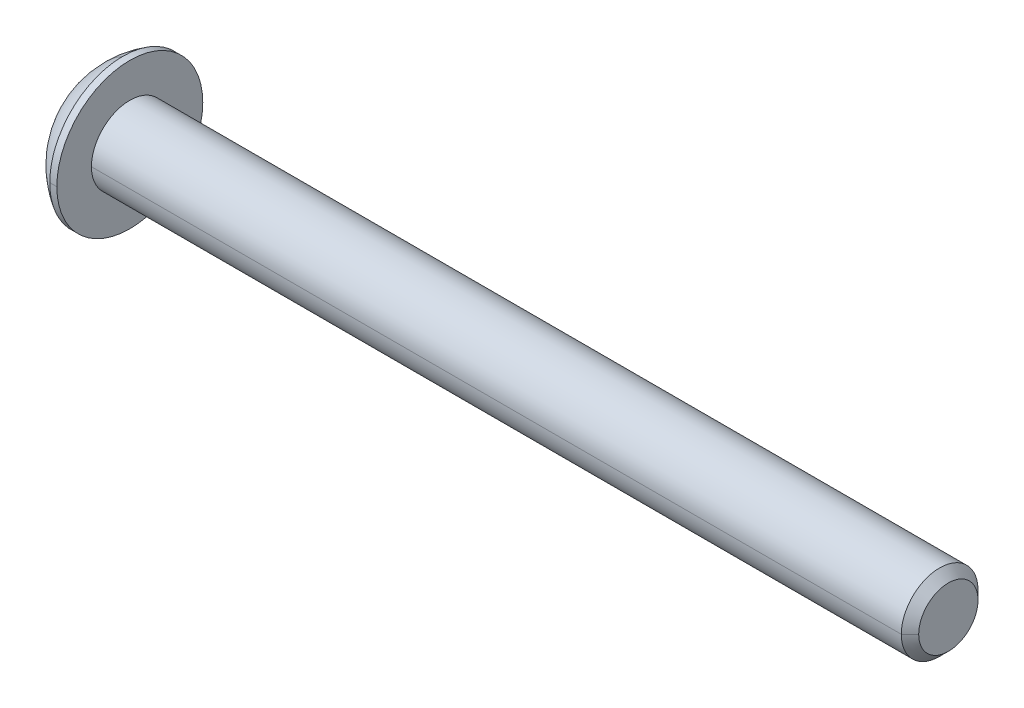
ISO-10303-21;
HEADER;
FILE_DESCRIPTION(('STEP AP214'),'2;1');
FILE_NAME('part.step','',(''),(''),'','','');
FILE_SCHEMA(('AUTOMOTIVE_DESIGN { 1 0 10303 214 1 1 1 1 }'));
ENDSEC;
DATA;
#1=APPLICATION_CONTEXT('core data for automotive mechanical design processes');
#2=APPLICATION_PROTOCOL_DEFINITION('international standard','automotive_design',2000,#1);
#3=PRODUCT_CONTEXT('',#1,'mechanical');
#4=PRODUCT('Part','Part','',(#3));
#5=PRODUCT_RELATED_PRODUCT_CATEGORY('part','',(#4));
#6=PRODUCT_DEFINITION_FORMATION('','',#4);
#7=PRODUCT_DEFINITION_CONTEXT('part definition',#1,'design');
#8=PRODUCT_DEFINITION('design','',#6,#7);
#9=PRODUCT_DEFINITION_SHAPE('','',#8);
#10=(LENGTH_UNIT() NAMED_UNIT(*) SI_UNIT(.MILLI.,.METRE.));
#11=(NAMED_UNIT(*) PLANE_ANGLE_UNIT() SI_UNIT($,.RADIAN.));
#12=(NAMED_UNIT(*) SI_UNIT($,.STERADIAN.) SOLID_ANGLE_UNIT());
#13=UNCERTAINTY_MEASURE_WITH_UNIT(LENGTH_MEASURE(1.E-05),#10,'distance_accuracy_value','');
#14=(GEOMETRIC_REPRESENTATION_CONTEXT(3) GLOBAL_UNCERTAINTY_ASSIGNED_CONTEXT((#13)) GLOBAL_UNIT_ASSIGNED_CONTEXT((#10,
#11,#12)) REPRESENTATION_CONTEXT('',''));
#15=CARTESIAN_POINT('',(0.,0.,0.));
#16=DIRECTION('',(0.,0.,1.));
#17=DIRECTION('',(1.,0.,0.));
#18=AXIS2_PLACEMENT_3D('',#15,#16,#17);
#19=CARTESIAN_POINT('',(-997.989959248641,0.,0.));
#20=DIRECTION('',(-1.,0.,0.));
#21=DIRECTION('',(0.,0.,1.));
#22=AXIS2_PLACEMENT_3D('',#19,#20,#21);
#23=CONICAL_SURFACE('',#22,1732.05080756886,1.0471975511966);
#24=DIRECTION('',(-0.5,0.,0.866025403784436));
#25=VECTOR('',#24,1.);
#26=CARTESIAN_POINT('',(2.01004075135859,0.,0.));
#27=LINE('',#26,#25);
#28=CARTESIAN_POINT('',(2.01004075135859,0.,0.));
#29=VERTEX_POINT('',#28);
#30=CARTESIAN_POINT('',(1.3208,0.,1.1938));
#31=VERTEX_POINT('',#30);
#32=EDGE_CURVE('E10',#29,#31,#27,.T.);
#33=ORIENTED_EDGE('',*,*,#32,.F.);
#34=DIRECTION('',(-0.5,0.,-0.866025403784436));
#35=VECTOR('',#34,1.);
#36=CARTESIAN_POINT('',(2.01004075135859,0.,0.));
#37=LINE('',#36,#35);
#38=CARTESIAN_POINT('',(1.3208,0.,-1.1938));
#39=VERTEX_POINT('',#38);
#40=EDGE_CURVE('E26',#29,#39,#37,.T.);
#41=ORIENTED_EDGE('',*,*,#40,.T.);
#42=CARTESIAN_POINT('',(1.3208,0.,0.));
#43=DIRECTION('',(-1.,0.,0.));
#44=DIRECTION('',(0.,0.,1.));
#45=AXIS2_PLACEMENT_3D('',#42,#43,#44);
#46=CIRCLE('',#45,1.1938);
#47=CARTESIAN_POINT('',(1.3208,-1.03386112703786,-0.5969));
#48=VERTEX_POINT('',#47);
#49=EDGE_CURVE('E185',#39,#48,#46,.T.);
#50=ORIENTED_EDGE('',*,*,#49,.T.);
#51=CARTESIAN_POINT('',(1.3208,0.,0.));
#52=DIRECTION('',(-1.,0.,0.));
#53=DIRECTION('',(0.,0.,1.));
#54=AXIS2_PLACEMENT_3D('',#51,#52,#53);
#55=CIRCLE('',#54,1.1938);
#56=CARTESIAN_POINT('',(1.3208,-1.03386112703786,0.5969));
#57=VERTEX_POINT('',#56);
#58=EDGE_CURVE('E182',#48,#57,#55,.T.);
#59=ORIENTED_EDGE('',*,*,#58,.T.);
#60=CARTESIAN_POINT('',(1.3208,0.,0.));
#61=DIRECTION('',(-1.,0.,0.));
#62=DIRECTION('',(0.,0.,1.));
#63=AXIS2_PLACEMENT_3D('',#60,#61,#62);
#64=CIRCLE('',#63,1.1938);
#65=EDGE_CURVE('E19',#57,#31,#64,.T.);
#66=ORIENTED_EDGE('',*,*,#65,.T.);
#67=EDGE_LOOP('',(#33,#41,#50,#59,#66));
#68=FACE_BOUND('',#67,.T.);
#69=ADVANCED_FACE('F15',(#68),#23,.F.);
#70=CARTESIAN_POINT('',(-997.989959248641,0.,0.));
#71=DIRECTION('',(-1.,0.,0.));
#72=DIRECTION('',(0.,0.,1.));
#73=AXIS2_PLACEMENT_3D('',#70,#71,#72);
#74=CONICAL_SURFACE('',#73,1732.05080756886,1.0471975511966);
#75=ORIENTED_EDGE('',*,*,#40,.F.);
#76=ORIENTED_EDGE('',*,*,#32,.T.);
#77=CARTESIAN_POINT('',(1.3208,0.,0.));
#78=DIRECTION('',(-1.,0.,0.));
#79=DIRECTION('',(0.,0.,1.));
#80=AXIS2_PLACEMENT_3D('',#77,#78,#79);
#81=CIRCLE('',#80,1.1938);
#82=CARTESIAN_POINT('',(1.3208,1.03386112703786,0.5969));
#83=VERTEX_POINT('',#82);
#84=EDGE_CURVE('E229',#31,#83,#81,.T.);
#85=ORIENTED_EDGE('',*,*,#84,.T.);
#86=CARTESIAN_POINT('',(1.3208,0.,0.));
#87=DIRECTION('',(-1.,0.,0.));
#88=DIRECTION('',(0.,0.,1.));
#89=AXIS2_PLACEMENT_3D('',#86,#87,#88);
#90=CIRCLE('',#89,1.1938);
#91=CARTESIAN_POINT('',(1.3208,1.03386112703786,-0.5969));
#92=VERTEX_POINT('',#91);
#93=EDGE_CURVE('E232',#83,#92,#90,.T.);
#94=ORIENTED_EDGE('',*,*,#93,.T.);
#95=CARTESIAN_POINT('',(1.3208,0.,0.));
#96=DIRECTION('',(-1.,0.,0.));
#97=DIRECTION('',(0.,0.,1.));
#98=AXIS2_PLACEMENT_3D('',#95,#96,#97);
#99=CIRCLE('',#98,1.1938);
#100=EDGE_CURVE('E134',#92,#39,#99,.T.);
#101=ORIENTED_EDGE('',*,*,#100,.T.);
#102=EDGE_LOOP('',(#75,#76,#85,#94,#101));
#103=FACE_BOUND('',#102,.T.);
#104=ADVANCED_FACE('F427',(#103),#74,.F.);
#105=CARTESIAN_POINT('',(1.3208,-2.06772225407573,-1.1938));
#106=DIRECTION('',(1.,0.,0.));
#107=DIRECTION('',(0.,1.,0.));
#108=AXIS2_PLACEMENT_3D('',#105,#106,#107);
#109=PLANE('',#108);
#110=ORIENTED_EDGE('',*,*,#100,.F.);
#111=DIRECTION('',(0.,0.5,0.866025403784439));
#112=VECTOR('',#111,1.);
#113=CARTESIAN_POINT('',(1.3208,1.37848150271715,0.));
#114=LINE('',#113,#112);
#115=CARTESIAN_POINT('',(1.3208,0.689240751358577,-1.1938));
#116=VERTEX_POINT('',#115);
#117=EDGE_CURVE('E157',#116,#92,#114,.T.);
#118=ORIENTED_EDGE('',*,*,#117,.F.);
#119=DIRECTION('',(0.,1.,0.));
#120=VECTOR('',#119,1.);
#121=CARTESIAN_POINT('',(1.3208,0.689240751358577,-1.1938));
#122=LINE('',#121,#120);
#123=EDGE_CURVE('E205',#39,#116,#122,.T.);
#124=ORIENTED_EDGE('',*,*,#123,.F.);
#125=EDGE_LOOP('',(#110,#118,#124));
#126=FACE_BOUND('',#125,.T.);
#127=ADVANCED_FACE('F422',(#126),#109,.F.);
#128=CARTESIAN_POINT('',(1.3208,-2.06772225407573,-1.1938));
#129=DIRECTION('',(1.,0.,0.));
#130=DIRECTION('',(0.,1.,0.));
#131=AXIS2_PLACEMENT_3D('',#128,#129,#130);
#132=PLANE('',#131);
#133=ORIENTED_EDGE('',*,*,#49,.F.);
#134=DIRECTION('',(0.,1.,0.));
#135=VECTOR('',#134,1.);
#136=CARTESIAN_POINT('',(1.3208,0.689240751358577,-1.1938));
#137=LINE('',#136,#135);
#138=CARTESIAN_POINT('',(1.3208,-0.689240751358574,-1.1938));
#139=VERTEX_POINT('',#138);
#140=EDGE_CURVE('E200',#139,#39,#137,.T.);
#141=ORIENTED_EDGE('',*,*,#140,.F.);
#142=DIRECTION('',(0.,0.5,-0.866025403784439));
#143=VECTOR('',#142,1.);
#144=CARTESIAN_POINT('',(1.3208,-0.689240751358574,-1.1938));
#145=LINE('',#144,#143);
#146=EDGE_CURVE('E201',#48,#139,#145,.T.);
#147=ORIENTED_EDGE('',*,*,#146,.F.);
#148=EDGE_LOOP('',(#133,#141,#147));
#149=FACE_BOUND('',#148,.T.);
#150=ADVANCED_FACE('F406',(#149),#132,.F.);
#151=CARTESIAN_POINT('',(1.3208,-2.06772225407573,-1.1938));
#152=DIRECTION('',(1.,0.,0.));
#153=DIRECTION('',(0.,1.,0.));
#154=AXIS2_PLACEMENT_3D('',#151,#152,#153);
#155=PLANE('',#154);
#156=ORIENTED_EDGE('',*,*,#58,.F.);
#157=DIRECTION('',(0.,0.5,-0.866025403784439));
#158=VECTOR('',#157,1.);
#159=CARTESIAN_POINT('',(1.3208,-0.689240751358574,-1.1938));
#160=LINE('',#159,#158);
#161=CARTESIAN_POINT('',(1.3208,-1.37848150271715,0.));
#162=VERTEX_POINT('',#161);
#163=EDGE_CURVE('E228',#162,#48,#160,.T.);
#164=ORIENTED_EDGE('',*,*,#163,.F.);
#165=DIRECTION('',(0.,-0.5,-0.866025403784439));
#166=VECTOR('',#165,1.);
#167=CARTESIAN_POINT('',(1.3208,-1.37848150271715,0.));
#168=LINE('',#167,#166);
#169=EDGE_CURVE('E238',#57,#162,#168,.T.);
#170=ORIENTED_EDGE('',*,*,#169,.F.);
#171=EDGE_LOOP('',(#156,#164,#170));
#172=FACE_BOUND('',#171,.T.);
#173=ADVANCED_FACE('F405',(#172),#155,.F.);
#174=CARTESIAN_POINT('',(1.3208,-2.06772225407573,-1.1938));
#175=DIRECTION('',(1.,0.,0.));
#176=DIRECTION('',(0.,1.,0.));
#177=AXIS2_PLACEMENT_3D('',#174,#175,#176);
#178=PLANE('',#177);
#179=ORIENTED_EDGE('',*,*,#65,.F.);
#180=DIRECTION('',(0.,-0.5,-0.866025403784439));
#181=VECTOR('',#180,1.);
#182=CARTESIAN_POINT('',(1.3208,-1.37848150271715,0.));
#183=LINE('',#182,#181);
#184=CARTESIAN_POINT('',(1.3208,-0.689240751358574,1.1938));
#185=VERTEX_POINT('',#184);
#186=EDGE_CURVE('E170',#185,#57,#183,.T.);
#187=ORIENTED_EDGE('',*,*,#186,.F.);
#188=DIRECTION('',(0.,-1.,0.));
#189=VECTOR('',#188,1.);
#190=CARTESIAN_POINT('',(1.3208,-0.689240751358574,1.1938));
#191=LINE('',#190,#189);
#192=EDGE_CURVE('E154',#31,#185,#191,.T.);
#193=ORIENTED_EDGE('',*,*,#192,.F.);
#194=EDGE_LOOP('',(#179,#187,#193));
#195=FACE_BOUND('',#194,.T.);
#196=ADVANCED_FACE('F17',(#195),#178,.F.);
#197=CARTESIAN_POINT('',(1.3208,-2.06772225407573,-1.1938));
#198=DIRECTION('',(1.,0.,0.));
#199=DIRECTION('',(0.,1.,0.));
#200=AXIS2_PLACEMENT_3D('',#197,#198,#199);
#201=PLANE('',#200);
#202=ORIENTED_EDGE('',*,*,#93,.F.);
#203=DIRECTION('',(0.,-0.5,0.866025403784439));
#204=VECTOR('',#203,1.);
#205=CARTESIAN_POINT('',(1.3208,0.689240751358576,1.1938));
#206=LINE('',#205,#204);
#207=CARTESIAN_POINT('',(1.3208,1.37848150271715,0.));
#208=VERTEX_POINT('',#207);
#209=EDGE_CURVE('E190',#208,#83,#206,.T.);
#210=ORIENTED_EDGE('',*,*,#209,.F.);
#211=DIRECTION('',(0.,0.5,0.866025403784439));
#212=VECTOR('',#211,1.);
#213=CARTESIAN_POINT('',(1.3208,1.37848150271715,0.));
#214=LINE('',#213,#212);
#215=EDGE_CURVE('E165',#92,#208,#214,.T.);
#216=ORIENTED_EDGE('',*,*,#215,.F.);
#217=EDGE_LOOP('',(#202,#210,#216));
#218=FACE_BOUND('',#217,.T.);
#219=ADVANCED_FACE('F444',(#218),#201,.F.);
#220=CARTESIAN_POINT('',(1.3208,-2.06772225407573,-1.1938));
#221=DIRECTION('',(1.,0.,0.));
#222=DIRECTION('',(0.,1.,0.));
#223=AXIS2_PLACEMENT_3D('',#220,#221,#222);
#224=PLANE('',#223);
#225=ORIENTED_EDGE('',*,*,#84,.F.);
#226=DIRECTION('',(0.,-1.,0.));
#227=VECTOR('',#226,1.);
#228=CARTESIAN_POINT('',(1.3208,-0.689240751358574,1.1938));
#229=LINE('',#228,#227);
#230=CARTESIAN_POINT('',(1.3208,0.689240751358576,1.1938));
#231=VERTEX_POINT('',#230);
#232=EDGE_CURVE('E158',#231,#31,#229,.T.);
#233=ORIENTED_EDGE('',*,*,#232,.F.);
#234=DIRECTION('',(0.,-0.5,0.866025403784439));
#235=VECTOR('',#234,1.);
#236=CARTESIAN_POINT('',(1.3208,0.689240751358576,1.1938));
#237=LINE('',#236,#235);
#238=EDGE_CURVE('E221',#83,#231,#237,.T.);
#239=ORIENTED_EDGE('',*,*,#238,.F.);
#240=EDGE_LOOP('',(#225,#233,#239));
#241=FACE_BOUND('',#240,.T.);
#242=ADVANCED_FACE('F438',(#241),#224,.F.);
#243=CARTESIAN_POINT('',(46.6598,0.,0.));
#244=DIRECTION('',(-1.,0.,0.));
#245=DIRECTION('',(0.,0.,1.));
#246=AXIS2_PLACEMENT_3D('',#243,#244,#245);
#247=PLANE('',#246);
#248=CARTESIAN_POINT('',(46.6598,0.,0.));
#249=DIRECTION('',(-1.,0.,0.));
#250=DIRECTION('',(0.,0.,1.));
#251=AXIS2_PLACEMENT_3D('',#248,#249,#250);
#252=CIRCLE('',#251,1.61036);
#253=CARTESIAN_POINT('',(46.6598,0.,1.61036));
#254=VERTEX_POINT('',#253);
#255=CARTESIAN_POINT('',(46.6598,0.,-1.61036));
#256=VERTEX_POINT('',#255);
#257=EDGE_CURVE('E196',#254,#256,#252,.T.);
#258=ORIENTED_EDGE('',*,*,#257,.F.);
#259=CARTESIAN_POINT('',(46.6598,0.,0.));
#260=DIRECTION('',(-1.,0.,0.));
#261=DIRECTION('',(0.,0.,1.));
#262=AXIS2_PLACEMENT_3D('',#259,#260,#261);
#263=CIRCLE('',#262,1.61036);
#264=EDGE_CURVE('E186',#256,#254,#263,.T.);
#265=ORIENTED_EDGE('',*,*,#264,.F.);
#266=EDGE_LOOP('',(#258,#265));
#267=FACE_BOUND('',#266,.T.);
#268=ADVANCED_FACE('F443',(#267),#247,.F.);
#269=CARTESIAN_POINT('',(1.3208,1.37848150271715,0.));
#270=DIRECTION('',(0.,-0.866025403784439,0.5));
#271=DIRECTION('',(-1.,0.,0.));
#272=AXIS2_PLACEMENT_3D('',#269,#270,#271);
#273=PLANE('',#272);
#274=ORIENTED_EDGE('',*,*,#117,.T.);
#275=ORIENTED_EDGE('',*,*,#215,.T.);
#276=DIRECTION('',(-1.,0.,0.));
#277=VECTOR('',#276,1.);
#278=CARTESIAN_POINT('',(1.3208,1.37848150271715,0.));
#279=LINE('',#278,#277);
#280=CARTESIAN_POINT('',(0.,1.37848150271715,0.));
#281=VERTEX_POINT('',#280);
#282=EDGE_CURVE('E166',#208,#281,#279,.T.);
#283=ORIENTED_EDGE('',*,*,#282,.T.);
#284=DIRECTION('',(0.,0.5,0.866025403784439));
#285=VECTOR('',#284,1.);
#286=CARTESIAN_POINT('',(0.,1.37848150271715,0.));
#287=LINE('',#286,#285);
#288=CARTESIAN_POINT('',(0.,0.689240751358577,-1.1938));
#289=VERTEX_POINT('',#288);
#290=EDGE_CURVE('E209',#289,#281,#287,.T.);
#291=ORIENTED_EDGE('',*,*,#290,.F.);
#292=DIRECTION('',(-1.,0.,0.));
#293=VECTOR('',#292,1.);
#294=CARTESIAN_POINT('',(1.3208,0.689240751358577,-1.1938));
#295=LINE('',#294,#293);
#296=EDGE_CURVE('E214',#116,#289,#295,.T.);
#297=ORIENTED_EDGE('',*,*,#296,.F.);
#298=EDGE_LOOP('',(#274,#275,#283,#291,#297));
#299=FACE_BOUND('',#298,.T.);
#300=ADVANCED_FACE('F558',(#299),#273,.T.);
#301=CARTESIAN_POINT('',(1.3208,-0.689240751358574,1.1938));
#302=DIRECTION('',(0.,0.,-1.));
#303=DIRECTION('',(-1.,0.,0.));
#304=AXIS2_PLACEMENT_3D('',#301,#302,#303);
#305=PLANE('',#304);
#306=ORIENTED_EDGE('',*,*,#232,.T.);
#307=ORIENTED_EDGE('',*,*,#192,.T.);
#308=DIRECTION('',(-1.,0.,0.));
#309=VECTOR('',#308,1.);
#310=CARTESIAN_POINT('',(1.3208,-0.689240751358574,1.1938));
#311=LINE('',#310,#309);
#312=CARTESIAN_POINT('',(0.,-0.689240751358574,1.1938));
#313=VERTEX_POINT('',#312);
#314=EDGE_CURVE('E237',#185,#313,#311,.T.);
#315=ORIENTED_EDGE('',*,*,#314,.T.);
#316=DIRECTION('',(0.,-1.,0.));
#317=VECTOR('',#316,1.);
#318=CARTESIAN_POINT('',(0.,-0.689240751358574,1.1938));
#319=LINE('',#318,#317);
#320=CARTESIAN_POINT('',(0.,0.689240751358576,1.1938));
#321=VERTEX_POINT('',#320);
#322=EDGE_CURVE('E249',#321,#313,#319,.T.);
#323=ORIENTED_EDGE('',*,*,#322,.F.);
#324=DIRECTION('',(-1.,0.,0.));
#325=VECTOR('',#324,1.);
#326=CARTESIAN_POINT('',(1.3208,0.689240751358576,1.1938));
#327=LINE('',#326,#325);
#328=EDGE_CURVE('E171',#231,#321,#327,.T.);
#329=ORIENTED_EDGE('',*,*,#328,.F.);
#330=EDGE_LOOP('',(#306,#307,#315,#323,#329));
#331=FACE_BOUND('',#330,.T.);
#332=ADVANCED_FACE('F563',(#331),#305,.T.);
#333=CARTESIAN_POINT('',(1.3208,0.689240751358577,-1.1938));
#334=DIRECTION('',(0.,0.,1.));
#335=DIRECTION('',(1.,0.,0.));
#336=AXIS2_PLACEMENT_3D('',#333,#334,#335);
#337=PLANE('',#336);
#338=ORIENTED_EDGE('',*,*,#140,.T.);
#339=ORIENTED_EDGE('',*,*,#123,.T.);
#340=ORIENTED_EDGE('',*,*,#296,.T.);
#341=DIRECTION('',(0.,1.,0.));
#342=VECTOR('',#341,1.);
#343=CARTESIAN_POINT('',(0.,0.689240751358577,-1.1938));
#344=LINE('',#343,#342);
#345=CARTESIAN_POINT('',(0.,-0.689240751358574,-1.1938));
#346=VERTEX_POINT('',#345);
#347=EDGE_CURVE('E152',#346,#289,#344,.T.);
#348=ORIENTED_EDGE('',*,*,#347,.F.);
#349=DIRECTION('',(-1.,0.,0.));
#350=VECTOR('',#349,1.);
#351=CARTESIAN_POINT('',(1.3208,-0.689240751358574,-1.1938));
#352=LINE('',#351,#350);
#353=EDGE_CURVE('E197',#139,#346,#352,.T.);
#354=ORIENTED_EDGE('',*,*,#353,.F.);
#355=EDGE_LOOP('',(#338,#339,#340,#348,#354));
#356=FACE_BOUND('',#355,.T.);
#357=ADVANCED_FACE('F549',(#356),#337,.T.);
#358=CARTESIAN_POINT('',(1.3208,-0.689240751358574,-1.1938));
#359=DIRECTION('',(0.,0.866025403784439,0.5));
#360=DIRECTION('',(1.,0.,0.));
#361=AXIS2_PLACEMENT_3D('',#358,#359,#360);
#362=PLANE('',#361);
#363=ORIENTED_EDGE('',*,*,#163,.T.);
#364=ORIENTED_EDGE('',*,*,#146,.T.);
#365=ORIENTED_EDGE('',*,*,#353,.T.);
#366=DIRECTION('',(0.,0.5,-0.866025403784439));
#367=VECTOR('',#366,1.);
#368=CARTESIAN_POINT('',(0.,-0.689240751358574,-1.1938));
#369=LINE('',#368,#367);
#370=CARTESIAN_POINT('',(0.,-1.37848150271715,0.));
#371=VERTEX_POINT('',#370);
#372=EDGE_CURVE('E148',#371,#346,#369,.T.);
#373=ORIENTED_EDGE('',*,*,#372,.F.);
#374=DIRECTION('',(-1.,0.,0.));
#375=VECTOR('',#374,1.);
#376=CARTESIAN_POINT('',(1.3208,-1.37848150271715,0.));
#377=LINE('',#376,#375);
#378=EDGE_CURVE('E242',#162,#371,#377,.T.);
#379=ORIENTED_EDGE('',*,*,#378,.F.);
#380=EDGE_LOOP('',(#363,#364,#365,#373,#379));
#381=FACE_BOUND('',#380,.T.);
#382=ADVANCED_FACE('F409',(#381),#362,.T.);
#383=CARTESIAN_POINT('',(1.3208,-1.37848150271715,0.));
#384=DIRECTION('',(0.,0.866025403784439,-0.5));
#385=DIRECTION('',(-1.,0.,0.));
#386=AXIS2_PLACEMENT_3D('',#383,#384,#385);
#387=PLANE('',#386);
#388=ORIENTED_EDGE('',*,*,#186,.T.);
#389=ORIENTED_EDGE('',*,*,#169,.T.);
#390=ORIENTED_EDGE('',*,*,#378,.T.);
#391=DIRECTION('',(0.,-0.5,-0.866025403784439));
#392=VECTOR('',#391,1.);
#393=CARTESIAN_POINT('',(0.,-1.37848150271715,0.));
#394=LINE('',#393,#392);
#395=EDGE_CURVE('E153',#313,#371,#394,.T.);
#396=ORIENTED_EDGE('',*,*,#395,.F.);
#397=ORIENTED_EDGE('',*,*,#314,.F.);
#398=EDGE_LOOP('',(#388,#389,#390,#396,#397));
#399=FACE_BOUND('',#398,.T.);
#400=ADVANCED_FACE('F410',(#399),#387,.T.);
#401=CARTESIAN_POINT('',(1.3208,0.689240751358576,1.1938));
#402=DIRECTION('',(0.,-0.866025403784439,-0.5));
#403=DIRECTION('',(0.,0.5,-0.866025403784439));
#404=AXIS2_PLACEMENT_3D('',#401,#402,#403);
#405=PLANE('',#404);
#406=ORIENTED_EDGE('',*,*,#209,.T.);
#407=ORIENTED_EDGE('',*,*,#238,.T.);
#408=ORIENTED_EDGE('',*,*,#328,.T.);
#409=DIRECTION('',(0.,-0.5,0.866025403784439));
#410=VECTOR('',#409,1.);
#411=CARTESIAN_POINT('',(0.,0.689240751358576,1.1938));
#412=LINE('',#411,#410);
#413=EDGE_CURVE('E206',#281,#321,#412,.T.);
#414=ORIENTED_EDGE('',*,*,#413,.F.);
#415=ORIENTED_EDGE('',*,*,#282,.F.);
#416=EDGE_LOOP('',(#406,#407,#408,#414,#415));
#417=FACE_BOUND('',#416,.T.);
#418=ADVANCED_FACE('F575',(#417),#405,.T.);
#419=CARTESIAN_POINT('',(46.6598,0.,0.));
#420=DIRECTION('',(-1.,0.,0.));
#421=DIRECTION('',(0.,0.,1.));
#422=AXIS2_PLACEMENT_3D('',#419,#420,#421);
#423=CONICAL_SURFACE('',#422,1.61036,0.785398163397452);
#424=DIRECTION('',(-0.707106781186545,0.,-0.70710678118655));
#425=VECTOR('',#424,1.);
#426=CARTESIAN_POINT('',(46.6598,0.,-1.61036));
#427=LINE('',#426,#425);
#428=CARTESIAN_POINT('',(46.18736,0.,-2.0828));
#429=VERTEX_POINT('',#428);
#430=EDGE_CURVE('E192',#256,#429,#427,.T.);
#431=ORIENTED_EDGE('',*,*,#430,.F.);
#432=ORIENTED_EDGE('',*,*,#264,.T.);
#433=DIRECTION('',(-0.707106781186545,0.,0.70710678118655));
#434=VECTOR('',#433,1.);
#435=CARTESIAN_POINT('',(46.6598,0.,1.61036));
#436=LINE('',#435,#434);
#437=CARTESIAN_POINT('',(46.18736,0.,2.0828));
#438=VERTEX_POINT('',#437);
#439=EDGE_CURVE('E191',#254,#438,#436,.T.);
#440=ORIENTED_EDGE('',*,*,#439,.T.);
#441=CARTESIAN_POINT('',(46.18736,0.,0.));
#442=DIRECTION('',(-1.,0.,0.));
#443=DIRECTION('',(0.,0.,1.));
#444=AXIS2_PLACEMENT_3D('',#441,#442,#443);
#445=CIRCLE('',#444,2.0828);
#446=EDGE_CURVE('E253',#429,#438,#445,.T.);
#447=ORIENTED_EDGE('',*,*,#446,.F.);
#448=EDGE_LOOP('',(#431,#432,#440,#447));
#449=FACE_BOUND('',#448,.T.);
#450=ADVANCED_FACE('F536',(#449),#423,.T.);
#451=CARTESIAN_POINT('',(46.6598,0.,0.));
#452=DIRECTION('',(-1.,0.,0.));
#453=DIRECTION('',(0.,0.,1.));
#454=AXIS2_PLACEMENT_3D('',#451,#452,#453);
#455=CONICAL_SURFACE('',#454,1.61036,0.785398163397452);
#456=ORIENTED_EDGE('',*,*,#257,.T.);
#457=ORIENTED_EDGE('',*,*,#430,.T.);
#458=CARTESIAN_POINT('',(46.18736,0.,0.));
#459=DIRECTION('',(-1.,0.,0.));
#460=DIRECTION('',(0.,0.,1.));
#461=AXIS2_PLACEMENT_3D('',#458,#459,#460);
#462=CIRCLE('',#461,2.0828);
#463=EDGE_CURVE('E141',#438,#429,#462,.T.);
#464=ORIENTED_EDGE('',*,*,#463,.F.);
#465=ORIENTED_EDGE('',*,*,#439,.F.);
#466=EDGE_LOOP('',(#456,#457,#464,#465));
#467=FACE_BOUND('',#466,.T.);
#468=ADVANCED_FACE('F472',(#467),#455,.T.);
#469=CARTESIAN_POINT('',(0.,0.,0.));
#470=DIRECTION('',(-1.,0.,0.));
#471=DIRECTION('',(0.,0.,1.));
#472=AXIS2_PLACEMENT_3D('',#469,#470,#471);
#473=PLANE('',#472);
#474=ORIENTED_EDGE('',*,*,#322,.T.);
#475=ORIENTED_EDGE('',*,*,#395,.T.);
#476=ORIENTED_EDGE('',*,*,#372,.T.);
#477=ORIENTED_EDGE('',*,*,#347,.T.);
#478=ORIENTED_EDGE('',*,*,#290,.T.);
#479=ORIENTED_EDGE('',*,*,#413,.T.);
#480=EDGE_LOOP('',(#474,#475,#476,#477,#478,#479));
#481=FACE_BOUND('',#480,.T.);
#482=CARTESIAN_POINT('',(0.,0.,0.));
#483=DIRECTION('',(-1.,0.,0.));
#484=DIRECTION('',(0.,0.,1.));
#485=AXIS2_PLACEMENT_3D('',#482,#483,#484);
#486=CIRCLE('',#485,1.9812);
#487=CARTESIAN_POINT('',(0.,1.9812,0.));
#488=VERTEX_POINT('',#487);
#489=CARTESIAN_POINT('',(0.,-1.9812,0.));
#490=VERTEX_POINT('',#489);
#491=EDGE_CURVE('E180',#488,#490,#486,.T.);
#492=ORIENTED_EDGE('',*,*,#491,.T.);
#493=CARTESIAN_POINT('',(0.,0.,0.));
#494=DIRECTION('',(-1.,0.,0.));
#495=DIRECTION('',(0.,0.,1.));
#496=AXIS2_PLACEMENT_3D('',#493,#494,#495);
#497=CIRCLE('',#496,1.9812);
#498=EDGE_CURVE('E139',#490,#488,#497,.T.);
#499=ORIENTED_EDGE('',*,*,#498,.T.);
#500=EDGE_LOOP('',(#492,#499));
#501=FACE_BOUND('',#500,.T.);
#502=ADVANCED_FACE('F335',(#481,#501),#473,.T.);
#503=CARTESIAN_POINT('',(0.,0.,0.));
#504=DIRECTION('',(-1.,0.,0.));
#505=DIRECTION('',(0.,0.,1.));
#506=AXIS2_PLACEMENT_3D('',#503,#504,#505);
#507=CYLINDRICAL_SURFACE('',#506,2.0828);
#508=DIRECTION('',(-1.,0.,0.));
#509=VECTOR('',#508,1.);
#510=CARTESIAN_POINT('',(0.,0.,-2.0828));
#511=LINE('',#510,#509);
#512=CARTESIAN_POINT('',(2.2098,0.,-2.0828));
#513=VERTEX_POINT('',#512);
#514=EDGE_CURVE('E145',#429,#513,#511,.T.);
#515=ORIENTED_EDGE('',*,*,#514,.F.);
#516=ORIENTED_EDGE('',*,*,#446,.T.);
#517=DIRECTION('',(-1.,0.,0.));
#518=VECTOR('',#517,1.);
#519=CARTESIAN_POINT('',(0.,0.,2.0828));
#520=LINE('',#519,#518);
#521=CARTESIAN_POINT('',(2.2098,0.,2.0828));
#522=VERTEX_POINT('',#521);
#523=EDGE_CURVE('E265',#438,#522,#520,.T.);
#524=ORIENTED_EDGE('',*,*,#523,.T.);
#525=CARTESIAN_POINT('',(2.2098,0.,0.));
#526=DIRECTION('',(-1.,0.,0.));
#527=DIRECTION('',(0.,0.,1.));
#528=AXIS2_PLACEMENT_3D('',#525,#526,#527);
#529=CIRCLE('',#528,2.0828);
#530=EDGE_CURVE('E175',#513,#522,#529,.T.);
#531=ORIENTED_EDGE('',*,*,#530,.F.);
#532=EDGE_LOOP('',(#515,#516,#524,#531));
#533=FACE_BOUND('',#532,.T.);
#534=ADVANCED_FACE('F458',(#533),#507,.T.);
#535=CARTESIAN_POINT('',(0.,0.,0.));
#536=DIRECTION('',(-1.,0.,0.));
#537=DIRECTION('',(0.,0.,1.));
#538=AXIS2_PLACEMENT_3D('',#535,#536,#537);
#539=CYLINDRICAL_SURFACE('',#538,2.0828);
#540=ORIENTED_EDGE('',*,*,#463,.T.);
#541=ORIENTED_EDGE('',*,*,#514,.T.);
#542=CARTESIAN_POINT('',(2.2098,0.,0.));
#543=DIRECTION('',(-1.,0.,0.));
#544=DIRECTION('',(0.,0.,1.));
#545=AXIS2_PLACEMENT_3D('',#542,#543,#544);
#546=CIRCLE('',#545,2.0828);
#547=EDGE_CURVE('E112',#522,#513,#546,.T.);
#548=ORIENTED_EDGE('',*,*,#547,.F.);
#549=ORIENTED_EDGE('',*,*,#523,.F.);
#550=EDGE_LOOP('',(#540,#541,#548,#549));
#551=FACE_BOUND('',#550,.T.);
#552=ADVANCED_FACE('F453',(#551),#539,.T.);
#553=CARTESIAN_POINT('',(0.,0.,0.));
#554=DIRECTION('',(-1.,0.,0.));
#555=DIRECTION('',(0.,0.,1.));
#556=AXIS2_PLACEMENT_3D('',#553,#554,#555);
#557=CYLINDRICAL_SURFACE('',#556,3.9624);
#558=DIRECTION('',(-1.,0.,0.));
#559=VECTOR('',#558,1.);
#560=CARTESIAN_POINT('',(0.,0.,-3.9624));
#561=LINE('',#560,#559);
#562=CARTESIAN_POINT('',(2.2098,0.,-3.9624));
#563=VERTEX_POINT('',#562);
#564=CARTESIAN_POINT('',(1.8288,0.,-3.9624));
#565=VERTEX_POINT('',#564);
#566=EDGE_CURVE('E107',#563,#565,#561,.T.);
#567=ORIENTED_EDGE('',*,*,#566,.F.);
#568=CARTESIAN_POINT('',(2.2098,0.,0.));
#569=DIRECTION('',(-1.,0.,0.));
#570=DIRECTION('',(0.,0.,1.));
#571=AXIS2_PLACEMENT_3D('',#568,#569,#570);
#572=CIRCLE('',#571,3.9624);
#573=CARTESIAN_POINT('',(2.2098,0.,3.9624));
#574=VERTEX_POINT('',#573);
#575=EDGE_CURVE('E99',#563,#574,#572,.T.);
#576=ORIENTED_EDGE('',*,*,#575,.T.);
#577=DIRECTION('',(-1.,0.,0.));
#578=VECTOR('',#577,1.);
#579=CARTESIAN_POINT('',(0.,0.,3.9624));
#580=LINE('',#579,#578);
#581=CARTESIAN_POINT('',(1.8288,0.,3.9624));
#582=VERTEX_POINT('',#581);
#583=EDGE_CURVE('E103',#574,#582,#580,.T.);
#584=ORIENTED_EDGE('',*,*,#583,.T.);
#585=CARTESIAN_POINT('',(1.8288,0.,0.));
#586=DIRECTION('',(-1.,0.,0.));
#587=DIRECTION('',(0.,0.,1.));
#588=AXIS2_PLACEMENT_3D('',#585,#586,#587);
#589=CIRCLE('',#588,3.9624);
#590=CARTESIAN_POINT('',(1.8288,-3.9624,0.));
#591=VERTEX_POINT('',#590);
#592=EDGE_CURVE('E136',#591,#582,#589,.T.);
#593=ORIENTED_EDGE('',*,*,#592,.F.);
#594=CARTESIAN_POINT('',(1.8288,0.,0.));
#595=DIRECTION('',(-1.,0.,0.));
#596=DIRECTION('',(0.,0.,1.));
#597=AXIS2_PLACEMENT_3D('',#594,#595,#596);
#598=CIRCLE('',#597,3.9624);
#599=EDGE_CURVE('E181',#565,#591,#598,.T.);
#600=ORIENTED_EDGE('',*,*,#599,.F.);
#601=EDGE_LOOP('',(#567,#576,#584,#593,#600));
#602=FACE_BOUND('',#601,.T.);
#603=ADVANCED_FACE('F101',(#602),#557,.T.);
#604=CARTESIAN_POINT('',(4.13385,0.,0.));
#605=DIRECTION('',(0.,0.,-1.));
#606=DIRECTION('',(0.,1.,0.));
#607=AXIS2_PLACEMENT_3D('',#604,#605,#606);
#608=SPHERICAL_SURFACE('',#607,4.58408870578439);
#609=CARTESIAN_POINT('',(4.13385,0.,0.));
#610=DIRECTION('',(0.,0.,-1.));
#611=DIRECTION('',(0.,1.,0.));
#612=AXIS2_PLACEMENT_3D('',#609,#610,#611);
#613=CIRCLE('',#612,4.58408870578439);
#614=EDGE_CURVE('E176',#591,#490,#613,.T.);
#615=ORIENTED_EDGE('',*,*,#614,.F.);
#616=ORIENTED_EDGE('',*,*,#592,.T.);
#617=CARTESIAN_POINT('',(1.8288,0.,0.));
#618=DIRECTION('',(-1.,0.,0.));
#619=DIRECTION('',(0.,0.,1.));
#620=AXIS2_PLACEMENT_3D('',#617,#618,#619);
#621=CIRCLE('',#620,3.9624);
#622=CARTESIAN_POINT('',(1.8288,3.9624,0.));
#623=VERTEX_POINT('',#622);
#624=EDGE_CURVE('E119',#582,#623,#621,.T.);
#625=ORIENTED_EDGE('',*,*,#624,.T.);
#626=CARTESIAN_POINT('',(4.13385,0.,0.));
#627=DIRECTION('',(0.,0.,1.));
#628=DIRECTION('',(1.,0.,0.));
#629=AXIS2_PLACEMENT_3D('',#626,#627,#628);
#630=CIRCLE('',#629,4.58408870578439);
#631=EDGE_CURVE('E140',#623,#488,#630,.T.);
#632=ORIENTED_EDGE('',*,*,#631,.T.);
#633=ORIENTED_EDGE('',*,*,#498,.F.);
#634=EDGE_LOOP('',(#615,#616,#625,#632,#633));
#635=FACE_BOUND('',#634,.T.);
#636=ADVANCED_FACE('F327',(#635),#608,.T.);
#637=CARTESIAN_POINT('',(4.13385,0.,0.));
#638=DIRECTION('',(0.,0.,-1.));
#639=DIRECTION('',(0.,1.,0.));
#640=AXIS2_PLACEMENT_3D('',#637,#638,#639);
#641=SPHERICAL_SURFACE('',#640,4.58408870578439);
#642=CARTESIAN_POINT('',(1.8288,0.,0.));
#643=DIRECTION('',(-1.,0.,0.));
#644=DIRECTION('',(0.,0.,1.));
#645=AXIS2_PLACEMENT_3D('',#642,#643,#644);
#646=CIRCLE('',#645,3.9624);
#647=EDGE_CURVE('E130',#623,#565,#646,.T.);
#648=ORIENTED_EDGE('',*,*,#647,.T.);
#649=ORIENTED_EDGE('',*,*,#599,.T.);
#650=ORIENTED_EDGE('',*,*,#614,.T.);
#651=ORIENTED_EDGE('',*,*,#491,.F.);
#652=ORIENTED_EDGE('',*,*,#631,.F.);
#653=EDGE_LOOP('',(#648,#649,#650,#651,#652));
#654=FACE_BOUND('',#653,.T.);
#655=ADVANCED_FACE('F333',(#654),#641,.T.);
#656=CARTESIAN_POINT('',(2.2098,2.0828,0.));
#657=DIRECTION('',(-1.,0.,0.));
#658=DIRECTION('',(0.,0.,1.));
#659=AXIS2_PLACEMENT_3D('',#656,#657,#658);
#660=PLANE('',#659);
#661=ORIENTED_EDGE('',*,*,#547,.T.);
#662=ORIENTED_EDGE('',*,*,#530,.T.);
#663=EDGE_LOOP('',(#661,#662));
#664=FACE_BOUND('',#663,.T.);
#665=CARTESIAN_POINT('',(2.2098,0.,0.));
#666=DIRECTION('',(-1.,0.,0.));
#667=DIRECTION('',(0.,0.,1.));
#668=AXIS2_PLACEMENT_3D('',#665,#666,#667);
#669=CIRCLE('',#668,3.9624);
#670=EDGE_CURVE('E116',#574,#563,#669,.T.);
#671=ORIENTED_EDGE('',*,*,#670,.F.);
#672=ORIENTED_EDGE('',*,*,#575,.F.);
#673=EDGE_LOOP('',(#671,#672));
#674=FACE_BOUND('',#673,.T.);
#675=ADVANCED_FACE('F122',(#664,#674),#660,.F.);
#676=CARTESIAN_POINT('',(0.,0.,0.));
#677=DIRECTION('',(-1.,0.,0.));
#678=DIRECTION('',(0.,0.,1.));
#679=AXIS2_PLACEMENT_3D('',#676,#677,#678);
#680=CYLINDRICAL_SURFACE('',#679,3.9624);
#681=ORIENTED_EDGE('',*,*,#670,.T.);
#682=ORIENTED_EDGE('',*,*,#566,.T.);
#683=ORIENTED_EDGE('',*,*,#647,.F.);
#684=ORIENTED_EDGE('',*,*,#624,.F.);
#685=ORIENTED_EDGE('',*,*,#583,.F.);
#686=EDGE_LOOP('',(#681,#682,#683,#684,#685));
#687=FACE_BOUND('',#686,.T.);
#688=ADVANCED_FACE('F115',(#687),#680,.T.);
#689=CLOSED_SHELL('',(#69,#104,#127,#150,#173,#196,#219,#242,#268,#300,#332,#357,#382,#400,#418,
#450,#468,#502,#534,#552,#603,#636,#655,#675,#688));
#690=MANIFOLD_SOLID_BREP('B1',#689);
#691=ADVANCED_BREP_SHAPE_REPRESENTATION('',(#18,#690),#14);
#692=SHAPE_DEFINITION_REPRESENTATION(#9,#691);
ENDSEC;
END-ISO-10303-21;
